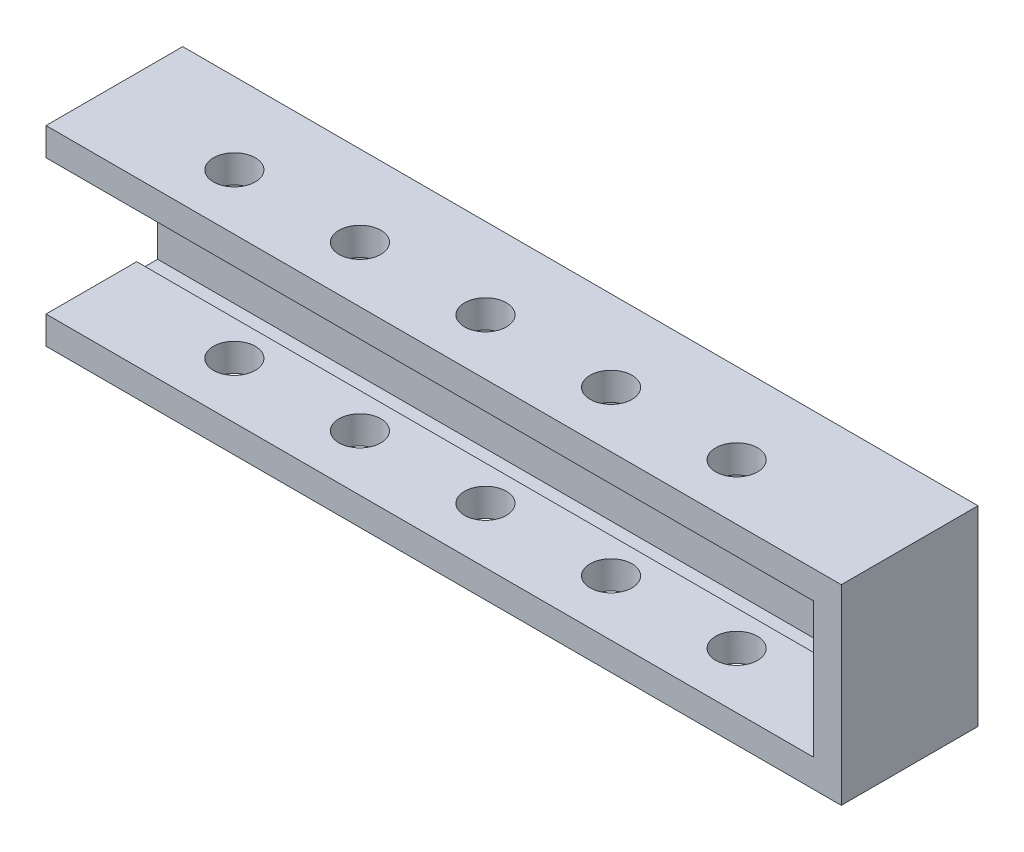
ISO-10303-21;
HEADER;
FILE_DESCRIPTION(('STEP AP214'),'2;1');
FILE_NAME('part.step','',(''),(''),'','','');
FILE_SCHEMA(('AUTOMOTIVE_DESIGN { 1 0 10303 214 1 1 1 1 }'));
ENDSEC;
DATA;
#1=APPLICATION_CONTEXT('core data for automotive mechanical design processes');
#2=APPLICATION_PROTOCOL_DEFINITION('international standard','automotive_design',2000,#1);
#3=PRODUCT_CONTEXT('',#1,'mechanical');
#4=PRODUCT('Part','Part','',(#3));
#5=PRODUCT_RELATED_PRODUCT_CATEGORY('part','',(#4));
#6=PRODUCT_DEFINITION_FORMATION('','',#4);
#7=PRODUCT_DEFINITION_CONTEXT('part definition',#1,'design');
#8=PRODUCT_DEFINITION('design','',#6,#7);
#9=PRODUCT_DEFINITION_SHAPE('','',#8);
#10=(LENGTH_UNIT() NAMED_UNIT(*) SI_UNIT(.MILLI.,.METRE.));
#11=(NAMED_UNIT(*) PLANE_ANGLE_UNIT() SI_UNIT($,.RADIAN.));
#12=(NAMED_UNIT(*) SI_UNIT($,.STERADIAN.) SOLID_ANGLE_UNIT());
#13=UNCERTAINTY_MEASURE_WITH_UNIT(LENGTH_MEASURE(1.E-05),#10,'distance_accuracy_value','');
#14=(GEOMETRIC_REPRESENTATION_CONTEXT(3) GLOBAL_UNCERTAINTY_ASSIGNED_CONTEXT((#13)) GLOBAL_UNIT_ASSIGNED_CONTEXT((#10,
#11,#12)) REPRESENTATION_CONTEXT('',''));
#15=CARTESIAN_POINT('',(0.,0.,0.));
#16=DIRECTION('',(0.,0.,1.));
#17=DIRECTION('',(1.,0.,0.));
#18=AXIS2_PLACEMENT_3D('',#15,#16,#17);
#19=CARTESIAN_POINT('',(0.,2.,1.8));
#20=DIRECTION('',(0.,-1.,0.));
#21=DIRECTION('',(0.,0.,-1.));
#22=AXIS2_PLACEMENT_3D('',#19,#20,#21);
#23=PLANE('',#22);
#24=CARTESIAN_POINT('',(9.5,2.,5.8));
#25=DIRECTION('',(0.,-1.,0.));
#26=DIRECTION('',(0.,0.,-1.));
#27=AXIS2_PLACEMENT_3D('',#24,#25,#26);
#28=CIRCLE('',#27,1.5);
#29=CARTESIAN_POINT('',(9.5,2.,4.3));
#30=VERTEX_POINT('',#29);
#31=EDGE_CURVE('E555',#30,#30,#28,.T.);
#32=ORIENTED_EDGE('',*,*,#31,.T.);
#33=EDGE_LOOP('',(#32));
#34=FACE_BOUND('',#33,.T.);
#35=CARTESIAN_POINT('',(18.5,2.,5.8));
#36=DIRECTION('',(0.,-1.,0.));
#37=DIRECTION('',(0.,0.,-1.));
#38=AXIS2_PLACEMENT_3D('',#35,#36,#37);
#39=CIRCLE('',#38,1.5);
#40=CARTESIAN_POINT('',(18.5,2.,4.3));
#41=VERTEX_POINT('',#40);
#42=EDGE_CURVE('E569',#41,#41,#39,.T.);
#43=ORIENTED_EDGE('',*,*,#42,.T.);
#44=EDGE_LOOP('',(#43));
#45=FACE_BOUND('',#44,.T.);
#46=CARTESIAN_POINT('',(27.5,2.,5.8));
#47=DIRECTION('',(0.,-1.,0.));
#48=DIRECTION('',(0.,0.,-1.));
#49=AXIS2_PLACEMENT_3D('',#46,#47,#48);
#50=CIRCLE('',#49,1.5);
#51=CARTESIAN_POINT('',(27.5,2.,4.3));
#52=VERTEX_POINT('',#51);
#53=EDGE_CURVE('E579',#52,#52,#50,.T.);
#54=ORIENTED_EDGE('',*,*,#53,.T.);
#55=EDGE_LOOP('',(#54));
#56=FACE_BOUND('',#55,.T.);
#57=CARTESIAN_POINT('',(36.5,2.,5.8));
#58=DIRECTION('',(0.,-1.,0.));
#59=DIRECTION('',(0.,0.,-1.));
#60=AXIS2_PLACEMENT_3D('',#57,#58,#59);
#61=CIRCLE('',#60,1.5);
#62=CARTESIAN_POINT('',(36.5,2.,4.3));
#63=VERTEX_POINT('',#62);
#64=EDGE_CURVE('E321',#63,#63,#61,.T.);
#65=ORIENTED_EDGE('',*,*,#64,.T.);
#66=EDGE_LOOP('',(#65));
#67=FACE_BOUND('',#66,.T.);
#68=CARTESIAN_POINT('',(45.5,2.,5.8));
#69=DIRECTION('',(0.,-1.,0.));
#70=DIRECTION('',(0.,0.,-1.));
#71=AXIS2_PLACEMENT_3D('',#68,#69,#70);
#72=CIRCLE('',#71,1.5);
#73=CARTESIAN_POINT('',(45.5,2.,4.3));
#74=VERTEX_POINT('',#73);
#75=EDGE_CURVE('E163',#74,#74,#72,.T.);
#76=ORIENTED_EDGE('',*,*,#75,.T.);
#77=EDGE_LOOP('',(#76));
#78=FACE_BOUND('',#77,.T.);
#79=DIRECTION('',(0.,0.,-1.));
#80=VECTOR('',#79,1.);
#81=CARTESIAN_POINT('',(54.9720870218535,2.,3.3));
#82=LINE('',#81,#80);
#83=CARTESIAN_POINT('',(54.9720870218535,2.,3.3));
#84=VERTEX_POINT('',#83);
#85=CARTESIAN_POINT('',(54.9720870218535,2.,1.8));
#86=VERTEX_POINT('',#85);
#87=EDGE_CURVE('E50',#84,#86,#82,.T.);
#88=ORIENTED_EDGE('',*,*,#87,.F.);
#89=DIRECTION('',(-1.,0.,0.));
#90=VECTOR('',#89,1.);
#91=CARTESIAN_POINT('',(0.,2.,3.3));
#92=LINE('',#91,#90);
#93=CARTESIAN_POINT('',(0.,2.,3.3));
#94=VERTEX_POINT('',#93);
#95=EDGE_CURVE('E167',#84,#94,#92,.T.);
#96=ORIENTED_EDGE('',*,*,#95,.T.);
#97=DIRECTION('',(0.,0.,1.));
#98=VECTOR('',#97,1.);
#99=CARTESIAN_POINT('',(0.,2.,1.8));
#100=LINE('',#99,#98);
#101=CARTESIAN_POINT('',(0.,2.,9.8));
#102=VERTEX_POINT('',#101);
#103=EDGE_CURVE('E58',#94,#102,#100,.T.);
#104=ORIENTED_EDGE('',*,*,#103,.T.);
#105=DIRECTION('',(1.,0.,0.));
#106=VECTOR('',#105,1.);
#107=CARTESIAN_POINT('',(0.,2.,9.8));
#108=LINE('',#107,#106);
#109=CARTESIAN_POINT('',(55.,2.,9.8));
#110=VERTEX_POINT('',#109);
#111=EDGE_CURVE('E195',#102,#110,#108,.T.);
#112=ORIENTED_EDGE('',*,*,#111,.T.);
#113=DIRECTION('',(0.,0.,1.));
#114=VECTOR('',#113,1.);
#115=CARTESIAN_POINT('',(55.,2.,1.8));
#116=LINE('',#115,#114);
#117=CARTESIAN_POINT('',(55.,2.,1.8));
#118=VERTEX_POINT('',#117);
#119=EDGE_CURVE('E218',#118,#110,#116,.T.);
#120=ORIENTED_EDGE('',*,*,#119,.F.);
#121=DIRECTION('',(1.,0.,0.));
#122=VECTOR('',#121,1.);
#123=CARTESIAN_POINT('',(0.,2.,1.8));
#124=LINE('',#123,#122);
#125=EDGE_CURVE('E198',#86,#118,#124,.T.);
#126=ORIENTED_EDGE('',*,*,#125,.F.);
#127=EDGE_LOOP('',(#88,#96,#104,#112,#120,#126));
#128=FACE_BOUND('',#127,.T.);
#129=ADVANCED_FACE('F35',(#34,#45,#56,#67,#78,#128),#23,.F.);
#130=CARTESIAN_POINT('',(0.,0.,9.8));
#131=DIRECTION('',(1.,0.,0.));
#132=DIRECTION('',(0.,0.,-1.));
#133=AXIS2_PLACEMENT_3D('',#130,#131,#132);
#134=PLANE('',#133);
#135=ORIENTED_EDGE('',*,*,#103,.F.);
#136=DIRECTION('',(0.,-1.,0.));
#137=VECTOR('',#136,1.);
#138=CARTESIAN_POINT('',(0.,2.,3.3));
#139=LINE('',#138,#137);
#140=CARTESIAN_POINT('',(0.,1.4,3.3));
#141=VERTEX_POINT('',#140);
#142=EDGE_CURVE('E143',#94,#141,#139,.T.);
#143=ORIENTED_EDGE('',*,*,#142,.T.);
#144=DIRECTION('',(0.,0.,-1.));
#145=VECTOR('',#144,1.);
#146=CARTESIAN_POINT('',(0.,1.4,3.3));
#147=LINE('',#146,#145);
#148=CARTESIAN_POINT('',(0.,1.4,1.8));
#149=VERTEX_POINT('',#148);
#150=EDGE_CURVE('E151',#141,#149,#147,.T.);
#151=ORIENTED_EDGE('',*,*,#150,.T.);
#152=DIRECTION('',(0.,-1.,0.));
#153=VECTOR('',#152,1.);
#154=CARTESIAN_POINT('',(0.,11.7,1.8));
#155=LINE('',#154,#153);
#156=CARTESIAN_POINT('',(0.,12.3,1.8));
#157=VERTEX_POINT('',#156);
#158=EDGE_CURVE('E196',#157,#149,#155,.T.);
#159=ORIENTED_EDGE('',*,*,#158,.F.);
#160=DIRECTION('',(0.,0.,-1.));
#161=VECTOR('',#160,1.);
#162=CARTESIAN_POINT('',(0.,12.3,3.3));
#163=LINE('',#162,#161);
#164=CARTESIAN_POINT('',(0.,12.3,3.3));
#165=VERTEX_POINT('',#164);
#166=EDGE_CURVE('E183',#165,#157,#163,.T.);
#167=ORIENTED_EDGE('',*,*,#166,.F.);
#168=DIRECTION('',(0.,-1.,0.));
#169=VECTOR('',#168,1.);
#170=CARTESIAN_POINT('',(0.,11.7,3.3));
#171=LINE('',#170,#169);
#172=CARTESIAN_POINT('',(0.,11.7,3.3));
#173=VERTEX_POINT('',#172);
#174=EDGE_CURVE('E172',#165,#173,#171,.T.);
#175=ORIENTED_EDGE('',*,*,#174,.T.);
#176=DIRECTION('',(0.,0.,1.));
#177=VECTOR('',#176,1.);
#178=CARTESIAN_POINT('',(0.,11.7,1.8));
#179=LINE('',#178,#177);
#180=CARTESIAN_POINT('',(0.,11.7,9.8));
#181=VERTEX_POINT('',#180);
#182=EDGE_CURVE('E213',#173,#181,#179,.T.);
#183=ORIENTED_EDGE('',*,*,#182,.T.);
#184=DIRECTION('',(0.,-1.,0.));
#185=VECTOR('',#184,1.);
#186=CARTESIAN_POINT('',(0.,0.,9.8));
#187=LINE('',#186,#185);
#188=CARTESIAN_POINT('',(0.,13.7,9.8));
#189=VERTEX_POINT('',#188);
#190=EDGE_CURVE('E221',#189,#181,#187,.T.);
#191=ORIENTED_EDGE('',*,*,#190,.F.);
#192=DIRECTION('',(0.,0.,-1.));
#193=VECTOR('',#192,1.);
#194=CARTESIAN_POINT('',(0.,13.7,9.8));
#195=LINE('',#194,#193);
#196=CARTESIAN_POINT('',(0.,13.7,0.));
#197=VERTEX_POINT('',#196);
#198=EDGE_CURVE('E231',#189,#197,#195,.T.);
#199=ORIENTED_EDGE('',*,*,#198,.T.);
#200=DIRECTION('',(0.,-1.,0.));
#201=VECTOR('',#200,1.);
#202=CARTESIAN_POINT('',(0.,0.,0.));
#203=LINE('',#202,#201);
#204=CARTESIAN_POINT('',(0.,0.,0.));
#205=VERTEX_POINT('',#204);
#206=EDGE_CURVE('E215',#197,#205,#203,.T.);
#207=ORIENTED_EDGE('',*,*,#206,.T.);
#208=DIRECTION('',(0.,0.,-1.));
#209=VECTOR('',#208,1.);
#210=CARTESIAN_POINT('',(0.,0.,9.8));
#211=LINE('',#210,#209);
#212=CARTESIAN_POINT('',(0.,0.,9.8));
#213=VERTEX_POINT('',#212);
#214=EDGE_CURVE('E11',#213,#205,#211,.T.);
#215=ORIENTED_EDGE('',*,*,#214,.F.);
#216=EDGE_CURVE('E225',#102,#213,#187,.T.);
#217=ORIENTED_EDGE('',*,*,#216,.F.);
#218=EDGE_LOOP('',(#135,#143,#151,#159,#167,#175,#183,#191,#199,#207,#215,#217));
#219=FACE_BOUND('',#218,.T.);
#220=ADVANCED_FACE('F37',(#219),#134,.F.);
#221=CARTESIAN_POINT('',(0.,11.7,1.8));
#222=DIRECTION('',(0.,1.,0.));
#223=DIRECTION('',(0.,0.,1.));
#224=AXIS2_PLACEMENT_3D('',#221,#222,#223);
#225=PLANE('',#224);
#226=CARTESIAN_POINT('',(9.5,11.7,5.8));
#227=DIRECTION('',(0.,1.,0.));
#228=DIRECTION('',(0.,0.,1.));
#229=AXIS2_PLACEMENT_3D('',#226,#227,#228);
#230=CIRCLE('',#229,1.5);
#231=CARTESIAN_POINT('',(9.5,11.7,7.3));
#232=VERTEX_POINT('',#231);
#233=EDGE_CURVE('E556',#232,#232,#230,.T.);
#234=ORIENTED_EDGE('',*,*,#233,.T.);
#235=EDGE_LOOP('',(#234));
#236=FACE_BOUND('',#235,.T.);
#237=CARTESIAN_POINT('',(18.5,11.7,5.8));
#238=DIRECTION('',(0.,1.,0.));
#239=DIRECTION('',(0.,0.,1.));
#240=AXIS2_PLACEMENT_3D('',#237,#238,#239);
#241=CIRCLE('',#240,1.5);
#242=CARTESIAN_POINT('',(18.5,11.7,7.3));
#243=VERTEX_POINT('',#242);
#244=EDGE_CURVE('E566',#243,#243,#241,.T.);
#245=ORIENTED_EDGE('',*,*,#244,.T.);
#246=EDGE_LOOP('',(#245));
#247=FACE_BOUND('',#246,.T.);
#248=CARTESIAN_POINT('',(27.5,11.7,5.8));
#249=DIRECTION('',(0.,1.,0.));
#250=DIRECTION('',(0.,0.,1.));
#251=AXIS2_PLACEMENT_3D('',#248,#249,#250);
#252=CIRCLE('',#251,1.5);
#253=CARTESIAN_POINT('',(27.5,11.7,7.3));
#254=VERTEX_POINT('',#253);
#255=EDGE_CURVE('E576',#254,#254,#252,.T.);
#256=ORIENTED_EDGE('',*,*,#255,.T.);
#257=EDGE_LOOP('',(#256));
#258=FACE_BOUND('',#257,.T.);
#259=CARTESIAN_POINT('',(36.5,11.7,5.8));
#260=DIRECTION('',(0.,1.,0.));
#261=DIRECTION('',(0.,0.,1.));
#262=AXIS2_PLACEMENT_3D('',#259,#260,#261);
#263=CIRCLE('',#262,1.5);
#264=CARTESIAN_POINT('',(36.5,11.7,7.30000000000001));
#265=VERTEX_POINT('',#264);
#266=EDGE_CURVE('E327',#265,#265,#263,.T.);
#267=ORIENTED_EDGE('',*,*,#266,.T.);
#268=EDGE_LOOP('',(#267));
#269=FACE_BOUND('',#268,.T.);
#270=CARTESIAN_POINT('',(45.5,11.7,5.8));
#271=DIRECTION('',(0.,1.,0.));
#272=DIRECTION('',(0.,0.,1.));
#273=AXIS2_PLACEMENT_3D('',#270,#271,#272);
#274=CIRCLE('',#273,1.5);
#275=CARTESIAN_POINT('',(45.5,11.7,7.30000000000001));
#276=VERTEX_POINT('',#275);
#277=EDGE_CURVE('E324',#276,#276,#274,.T.);
#278=ORIENTED_EDGE('',*,*,#277,.T.);
#279=EDGE_LOOP('',(#278));
#280=FACE_BOUND('',#279,.T.);
#281=DIRECTION('',(0.,0.,-1.));
#282=VECTOR('',#281,1.);
#283=CARTESIAN_POINT('',(54.9720870218535,11.7,3.3));
#284=LINE('',#283,#282);
#285=CARTESIAN_POINT('',(54.9720870218535,11.7,3.3));
#286=VERTEX_POINT('',#285);
#287=CARTESIAN_POINT('',(54.9720870218535,11.7,1.8));
#288=VERTEX_POINT('',#287);
#289=EDGE_CURVE('E192',#286,#288,#284,.T.);
#290=ORIENTED_EDGE('',*,*,#289,.T.);
#291=DIRECTION('',(-1.,0.,0.));
#292=VECTOR('',#291,1.);
#293=CARTESIAN_POINT('',(0.,11.7,1.8));
#294=LINE('',#293,#292);
#295=CARTESIAN_POINT('',(55.,11.7,1.8));
#296=VERTEX_POINT('',#295);
#297=EDGE_CURVE('E204',#296,#288,#294,.T.);
#298=ORIENTED_EDGE('',*,*,#297,.F.);
#299=DIRECTION('',(0.,0.,1.));
#300=VECTOR('',#299,1.);
#301=CARTESIAN_POINT('',(55.,11.7,1.8));
#302=LINE('',#301,#300);
#303=CARTESIAN_POINT('',(55.,11.7,9.8));
#304=VERTEX_POINT('',#303);
#305=EDGE_CURVE('E216',#296,#304,#302,.T.);
#306=ORIENTED_EDGE('',*,*,#305,.T.);
#307=DIRECTION('',(-1.,0.,0.));
#308=VECTOR('',#307,1.);
#309=CARTESIAN_POINT('',(0.,11.7,9.8));
#310=LINE('',#309,#308);
#311=EDGE_CURVE('E199',#304,#181,#310,.T.);
#312=ORIENTED_EDGE('',*,*,#311,.T.);
#313=ORIENTED_EDGE('',*,*,#182,.F.);
#314=DIRECTION('',(1.,0.,0.));
#315=VECTOR('',#314,1.);
#316=CARTESIAN_POINT('',(0.,11.7,3.3));
#317=LINE('',#316,#315);
#318=EDGE_CURVE('E175',#173,#286,#317,.T.);
#319=ORIENTED_EDGE('',*,*,#318,.T.);
#320=EDGE_LOOP('',(#290,#298,#306,#312,#313,#319));
#321=FACE_BOUND('',#320,.T.);
#322=ADVANCED_FACE('F270',(#236,#247,#258,#269,#280,#321),#225,.F.);
#323=CARTESIAN_POINT('',(0.,0.,9.8));
#324=DIRECTION('',(0.,1.,0.));
#325=DIRECTION('',(0.,0.,1.));
#326=AXIS2_PLACEMENT_3D('',#323,#324,#325);
#327=PLANE('',#326);
#328=CARTESIAN_POINT('',(9.5,0.,5.8));
#329=DIRECTION('',(0.,1.,0.));
#330=DIRECTION('',(0.,0.,1.));
#331=AXIS2_PLACEMENT_3D('',#328,#329,#330);
#332=CIRCLE('',#331,1.5);
#333=CARTESIAN_POINT('',(9.5,0.,7.3));
#334=VERTEX_POINT('',#333);
#335=EDGE_CURVE('E553',#334,#334,#332,.T.);
#336=ORIENTED_EDGE('',*,*,#335,.T.);
#337=EDGE_LOOP('',(#336));
#338=FACE_BOUND('',#337,.T.);
#339=CARTESIAN_POINT('',(18.5,0.,5.8));
#340=DIRECTION('',(0.,1.,0.));
#341=DIRECTION('',(0.,0.,1.));
#342=AXIS2_PLACEMENT_3D('',#339,#340,#341);
#343=CIRCLE('',#342,1.5);
#344=CARTESIAN_POINT('',(18.5,0.,7.3));
#345=VERTEX_POINT('',#344);
#346=EDGE_CURVE('E558',#345,#345,#343,.T.);
#347=ORIENTED_EDGE('',*,*,#346,.T.);
#348=EDGE_LOOP('',(#347));
#349=FACE_BOUND('',#348,.T.);
#350=CARTESIAN_POINT('',(27.5,0.,5.8));
#351=DIRECTION('',(0.,1.,0.));
#352=DIRECTION('',(0.,0.,1.));
#353=AXIS2_PLACEMENT_3D('',#350,#351,#352);
#354=CIRCLE('',#353,1.5);
#355=CARTESIAN_POINT('',(27.5,0.,7.3));
#356=VERTEX_POINT('',#355);
#357=EDGE_CURVE('E573',#356,#356,#354,.T.);
#358=ORIENTED_EDGE('',*,*,#357,.T.);
#359=EDGE_LOOP('',(#358));
#360=FACE_BOUND('',#359,.T.);
#361=CARTESIAN_POINT('',(36.5,0.,5.8));
#362=DIRECTION('',(0.,1.,0.));
#363=DIRECTION('',(0.,0.,1.));
#364=AXIS2_PLACEMENT_3D('',#361,#362,#363);
#365=CIRCLE('',#364,1.5);
#366=CARTESIAN_POINT('',(36.5,0.,7.30000000000001));
#367=VERTEX_POINT('',#366);
#368=EDGE_CURVE('E583',#367,#367,#365,.T.);
#369=ORIENTED_EDGE('',*,*,#368,.T.);
#370=EDGE_LOOP('',(#369));
#371=FACE_BOUND('',#370,.T.);
#372=CARTESIAN_POINT('',(45.5,0.,5.8));
#373=DIRECTION('',(0.,1.,0.));
#374=DIRECTION('',(0.,0.,1.));
#375=AXIS2_PLACEMENT_3D('',#372,#373,#374);
#376=CIRCLE('',#375,1.5);
#377=CARTESIAN_POINT('',(45.5,0.,7.30000000000001));
#378=VERTEX_POINT('',#377);
#379=EDGE_CURVE('E320',#378,#378,#376,.T.);
#380=ORIENTED_EDGE('',*,*,#379,.T.);
#381=EDGE_LOOP('',(#380));
#382=FACE_BOUND('',#381,.T.);
#383=DIRECTION('',(1.,0.,0.));
#384=VECTOR('',#383,1.);
#385=CARTESIAN_POINT('',(0.,0.,0.));
#386=LINE('',#385,#384);
#387=CARTESIAN_POINT('',(57.,0.,0.));
#388=VERTEX_POINT('',#387);
#389=EDGE_CURVE('E234',#205,#388,#386,.T.);
#390=ORIENTED_EDGE('',*,*,#389,.T.);
#391=DIRECTION('',(0.,0.,-1.));
#392=VECTOR('',#391,1.);
#393=CARTESIAN_POINT('',(57.,0.,9.8));
#394=LINE('',#393,#392);
#395=CARTESIAN_POINT('',(57.,0.,9.8));
#396=VERTEX_POINT('',#395);
#397=EDGE_CURVE('E43',#396,#388,#394,.T.);
#398=ORIENTED_EDGE('',*,*,#397,.F.);
#399=DIRECTION('',(1.,0.,0.));
#400=VECTOR('',#399,1.);
#401=CARTESIAN_POINT('',(0.,0.,9.8));
#402=LINE('',#401,#400);
#403=EDGE_CURVE('E224',#213,#396,#402,.T.);
#404=ORIENTED_EDGE('',*,*,#403,.F.);
#405=ORIENTED_EDGE('',*,*,#214,.T.);
#406=EDGE_LOOP('',(#390,#398,#404,#405));
#407=FACE_BOUND('',#406,.T.);
#408=ADVANCED_FACE('F268',(#338,#349,#360,#371,#382,#407),#327,.F.);
#409=CARTESIAN_POINT('',(57.,0.,9.8));
#410=DIRECTION('',(-1.,0.,0.));
#411=DIRECTION('',(0.,0.,1.));
#412=AXIS2_PLACEMENT_3D('',#409,#410,#411);
#413=PLANE('',#412);
#414=DIRECTION('',(0.,1.,0.));
#415=VECTOR('',#414,1.);
#416=CARTESIAN_POINT('',(57.,0.,0.));
#417=LINE('',#416,#415);
#418=CARTESIAN_POINT('',(57.,13.7,0.));
#419=VERTEX_POINT('',#418);
#420=EDGE_CURVE('E236',#388,#419,#417,.T.);
#421=ORIENTED_EDGE('',*,*,#420,.T.);
#422=DIRECTION('',(0.,0.,-1.));
#423=VECTOR('',#422,1.);
#424=CARTESIAN_POINT('',(57.,13.7,9.8));
#425=LINE('',#424,#423);
#426=CARTESIAN_POINT('',(57.,13.7,9.8));
#427=VERTEX_POINT('',#426);
#428=EDGE_CURVE('E242',#427,#419,#425,.T.);
#429=ORIENTED_EDGE('',*,*,#428,.F.);
#430=DIRECTION('',(0.,1.,0.));
#431=VECTOR('',#430,1.);
#432=CARTESIAN_POINT('',(57.,0.,9.8));
#433=LINE('',#432,#431);
#434=EDGE_CURVE('E227',#396,#427,#433,.T.);
#435=ORIENTED_EDGE('',*,*,#434,.F.);
#436=ORIENTED_EDGE('',*,*,#397,.T.);
#437=EDGE_LOOP('',(#421,#429,#435,#436));
#438=FACE_BOUND('',#437,.T.);
#439=ADVANCED_FACE('F249',(#438),#413,.F.);
#440=CARTESIAN_POINT('',(0.,13.7,9.8));
#441=DIRECTION('',(0.,-1.,0.));
#442=DIRECTION('',(0.,0.,-1.));
#443=AXIS2_PLACEMENT_3D('',#440,#441,#442);
#444=PLANE('',#443);
#445=CARTESIAN_POINT('',(9.5,13.7,5.8));
#446=DIRECTION('',(0.,1.,0.));
#447=DIRECTION('',(0.,0.,1.));
#448=AXIS2_PLACEMENT_3D('',#445,#446,#447);
#449=CIRCLE('',#448,1.5);
#450=CARTESIAN_POINT('',(9.5,13.7,7.3));
#451=VERTEX_POINT('',#450);
#452=EDGE_CURVE('E303',#451,#451,#449,.T.);
#453=ORIENTED_EDGE('',*,*,#452,.F.);
#454=EDGE_LOOP('',(#453));
#455=FACE_BOUND('',#454,.T.);
#456=CARTESIAN_POINT('',(18.5,13.7,5.8));
#457=DIRECTION('',(0.,1.,0.));
#458=DIRECTION('',(0.,0.,1.));
#459=AXIS2_PLACEMENT_3D('',#456,#457,#458);
#460=CIRCLE('',#459,1.5);
#461=CARTESIAN_POINT('',(18.5,13.7,7.3));
#462=VERTEX_POINT('',#461);
#463=EDGE_CURVE('E307',#462,#462,#460,.T.);
#464=ORIENTED_EDGE('',*,*,#463,.F.);
#465=EDGE_LOOP('',(#464));
#466=FACE_BOUND('',#465,.T.);
#467=CARTESIAN_POINT('',(27.5,13.7,5.8));
#468=DIRECTION('',(0.,1.,0.));
#469=DIRECTION('',(0.,0.,1.));
#470=AXIS2_PLACEMENT_3D('',#467,#468,#469);
#471=CIRCLE('',#470,1.5);
#472=CARTESIAN_POINT('',(27.5,13.7,7.3));
#473=VERTEX_POINT('',#472);
#474=EDGE_CURVE('E311',#473,#473,#471,.T.);
#475=ORIENTED_EDGE('',*,*,#474,.F.);
#476=EDGE_LOOP('',(#475));
#477=FACE_BOUND('',#476,.T.);
#478=CARTESIAN_POINT('',(36.5,13.7,5.8));
#479=DIRECTION('',(0.,1.,0.));
#480=DIRECTION('',(0.,0.,1.));
#481=AXIS2_PLACEMENT_3D('',#478,#479,#480);
#482=CIRCLE('',#481,1.5);
#483=CARTESIAN_POINT('',(36.5,13.7,7.30000000000001));
#484=VERTEX_POINT('',#483);
#485=EDGE_CURVE('E315',#484,#484,#482,.T.);
#486=ORIENTED_EDGE('',*,*,#485,.F.);
#487=EDGE_LOOP('',(#486));
#488=FACE_BOUND('',#487,.T.);
#489=CARTESIAN_POINT('',(45.5,13.7,5.8));
#490=DIRECTION('',(0.,1.,0.));
#491=DIRECTION('',(0.,0.,1.));
#492=AXIS2_PLACEMENT_3D('',#489,#490,#491);
#493=CIRCLE('',#492,1.5);
#494=CARTESIAN_POINT('',(45.5,13.7,7.30000000000001));
#495=VERTEX_POINT('',#494);
#496=EDGE_CURVE('E318',#495,#495,#493,.T.);
#497=ORIENTED_EDGE('',*,*,#496,.F.);
#498=EDGE_LOOP('',(#497));
#499=FACE_BOUND('',#498,.T.);
#500=DIRECTION('',(-1.,0.,0.));
#501=VECTOR('',#500,1.);
#502=CARTESIAN_POINT('',(0.,13.7,0.));
#503=LINE('',#502,#501);
#504=EDGE_CURVE('E238',#419,#197,#503,.T.);
#505=ORIENTED_EDGE('',*,*,#504,.T.);
#506=ORIENTED_EDGE('',*,*,#198,.F.);
#507=DIRECTION('',(-1.,0.,0.));
#508=VECTOR('',#507,1.);
#509=CARTESIAN_POINT('',(0.,13.7,9.8));
#510=LINE('',#509,#508);
#511=EDGE_CURVE('E229',#427,#189,#510,.T.);
#512=ORIENTED_EDGE('',*,*,#511,.F.);
#513=ORIENTED_EDGE('',*,*,#428,.T.);
#514=EDGE_LOOP('',(#505,#506,#512,#513));
#515=FACE_BOUND('',#514,.T.);
#516=ADVANCED_FACE('F259',(#455,#466,#477,#488,#499,#515),#444,.F.);
#517=CARTESIAN_POINT('',(0.,0.,9.8));
#518=DIRECTION('',(0.,0.,-1.));
#519=DIRECTION('',(-1.,0.,0.));
#520=AXIS2_PLACEMENT_3D('',#517,#518,#519);
#521=PLANE('',#520);
#522=ORIENTED_EDGE('',*,*,#190,.T.);
#523=ORIENTED_EDGE('',*,*,#311,.F.);
#524=DIRECTION('',(0.,1.,0.));
#525=VECTOR('',#524,1.);
#526=CARTESIAN_POINT('',(55.,11.7,9.8));
#527=LINE('',#526,#525);
#528=EDGE_CURVE('E208',#110,#304,#527,.T.);
#529=ORIENTED_EDGE('',*,*,#528,.F.);
#530=ORIENTED_EDGE('',*,*,#111,.F.);
#531=ORIENTED_EDGE('',*,*,#216,.T.);
#532=ORIENTED_EDGE('',*,*,#403,.T.);
#533=ORIENTED_EDGE('',*,*,#434,.T.);
#534=ORIENTED_EDGE('',*,*,#511,.T.);
#535=EDGE_LOOP('',(#522,#523,#529,#530,#531,#532,#533,#534));
#536=FACE_BOUND('',#535,.T.);
#537=ADVANCED_FACE('F266',(#536),#521,.F.);
#538=CARTESIAN_POINT('',(0.,0.,0.));
#539=DIRECTION('',(0.,0.,-1.));
#540=DIRECTION('',(-1.,0.,0.));
#541=AXIS2_PLACEMENT_3D('',#538,#539,#540);
#542=PLANE('',#541);
#543=ORIENTED_EDGE('',*,*,#206,.F.);
#544=ORIENTED_EDGE('',*,*,#504,.F.);
#545=ORIENTED_EDGE('',*,*,#420,.F.);
#546=ORIENTED_EDGE('',*,*,#389,.F.);
#547=EDGE_LOOP('',(#543,#544,#545,#546));
#548=FACE_BOUND('',#547,.T.);
#549=ADVANCED_FACE('F256',(#548),#542,.T.);
#550=CARTESIAN_POINT('',(55.,11.7,1.8));
#551=DIRECTION('',(1.,0.,0.));
#552=DIRECTION('',(0.,0.,-1.));
#553=AXIS2_PLACEMENT_3D('',#550,#551,#552);
#554=PLANE('',#553);
#555=ORIENTED_EDGE('',*,*,#528,.T.);
#556=ORIENTED_EDGE('',*,*,#305,.F.);
#557=DIRECTION('',(0.,1.,0.));
#558=VECTOR('',#557,1.);
#559=CARTESIAN_POINT('',(55.,11.7,1.8));
#560=LINE('',#559,#558);
#561=EDGE_CURVE('E201',#118,#296,#560,.T.);
#562=ORIENTED_EDGE('',*,*,#561,.F.);
#563=ORIENTED_EDGE('',*,*,#119,.T.);
#564=EDGE_LOOP('',(#555,#556,#562,#563));
#565=FACE_BOUND('',#564,.T.);
#566=ADVANCED_FACE('F291',(#565),#554,.F.);
#567=CARTESIAN_POINT('',(0.,0.,1.8));
#568=DIRECTION('',(0.,0.,1.));
#569=DIRECTION('',(1.,0.,0.));
#570=AXIS2_PLACEMENT_3D('',#567,#568,#569);
#571=PLANE('',#570);
#572=ORIENTED_EDGE('',*,*,#158,.T.);
#573=DIRECTION('',(1.,0.,0.));
#574=VECTOR('',#573,1.);
#575=CARTESIAN_POINT('',(0.,1.4,1.8));
#576=LINE('',#575,#574);
#577=CARTESIAN_POINT('',(54.9720870218535,1.4,1.8));
#578=VERTEX_POINT('',#577);
#579=EDGE_CURVE('E153',#149,#578,#576,.T.);
#580=ORIENTED_EDGE('',*,*,#579,.T.);
#581=DIRECTION('',(0.,1.,0.));
#582=VECTOR('',#581,1.);
#583=CARTESIAN_POINT('',(54.9720870218535,2.,1.8));
#584=LINE('',#583,#582);
#585=EDGE_CURVE('E159',#578,#86,#584,.T.);
#586=ORIENTED_EDGE('',*,*,#585,.T.);
#587=ORIENTED_EDGE('',*,*,#125,.T.);
#588=ORIENTED_EDGE('',*,*,#561,.T.);
#589=ORIENTED_EDGE('',*,*,#297,.T.);
#590=DIRECTION('',(0.,1.,0.));
#591=VECTOR('',#590,1.);
#592=CARTESIAN_POINT('',(54.9720870218535,11.7,1.8));
#593=LINE('',#592,#591);
#594=CARTESIAN_POINT('',(54.9720870218535,12.3,1.8));
#595=VERTEX_POINT('',#594);
#596=EDGE_CURVE('E155',#288,#595,#593,.T.);
#597=ORIENTED_EDGE('',*,*,#596,.T.);
#598=DIRECTION('',(-1.,0.,0.));
#599=VECTOR('',#598,1.);
#600=CARTESIAN_POINT('',(0.,12.3,1.8));
#601=LINE('',#600,#599);
#602=EDGE_CURVE('E176',#595,#157,#601,.T.);
#603=ORIENTED_EDGE('',*,*,#602,.T.);
#604=EDGE_LOOP('',(#572,#580,#586,#587,#588,#589,#597,#603));
#605=FACE_BOUND('',#604,.T.);
#606=ADVANCED_FACE('F371',(#605),#571,.T.);
#607=CARTESIAN_POINT('',(54.9720870218535,11.7,3.3));
#608=DIRECTION('',(-1.,0.,0.));
#609=DIRECTION('',(0.,0.,1.));
#610=AXIS2_PLACEMENT_3D('',#607,#608,#609);
#611=PLANE('',#610);
#612=ORIENTED_EDGE('',*,*,#596,.F.);
#613=ORIENTED_EDGE('',*,*,#289,.F.);
#614=DIRECTION('',(0.,1.,0.));
#615=VECTOR('',#614,1.);
#616=CARTESIAN_POINT('',(54.9720870218535,11.7,3.3));
#617=LINE('',#616,#615);
#618=CARTESIAN_POINT('',(54.9720870218535,12.3,3.3));
#619=VERTEX_POINT('',#618);
#620=EDGE_CURVE('E179',#286,#619,#617,.T.);
#621=ORIENTED_EDGE('',*,*,#620,.T.);
#622=DIRECTION('',(0.,0.,-1.));
#623=VECTOR('',#622,1.);
#624=CARTESIAN_POINT('',(54.9720870218535,12.3,3.3));
#625=LINE('',#624,#623);
#626=EDGE_CURVE('E189',#619,#595,#625,.T.);
#627=ORIENTED_EDGE('',*,*,#626,.T.);
#628=EDGE_LOOP('',(#612,#613,#621,#627));
#629=FACE_BOUND('',#628,.T.);
#630=ADVANCED_FACE('F367',(#629),#611,.T.);
#631=CARTESIAN_POINT('',(0.,12.3,3.3));
#632=DIRECTION('',(0.,-1.,0.));
#633=DIRECTION('',(0.,0.,-1.));
#634=AXIS2_PLACEMENT_3D('',#631,#632,#633);
#635=PLANE('',#634);
#636=ORIENTED_EDGE('',*,*,#602,.F.);
#637=ORIENTED_EDGE('',*,*,#626,.F.);
#638=DIRECTION('',(-1.,0.,0.));
#639=VECTOR('',#638,1.);
#640=CARTESIAN_POINT('',(0.,12.3,3.3));
#641=LINE('',#640,#639);
#642=EDGE_CURVE('E181',#619,#165,#641,.T.);
#643=ORIENTED_EDGE('',*,*,#642,.T.);
#644=ORIENTED_EDGE('',*,*,#166,.T.);
#645=EDGE_LOOP('',(#636,#637,#643,#644));
#646=FACE_BOUND('',#645,.T.);
#647=ADVANCED_FACE('F363',(#646),#635,.T.);
#648=CARTESIAN_POINT('',(0.,0.,3.3));
#649=DIRECTION('',(0.,0.,-1.));
#650=DIRECTION('',(-1.,0.,0.));
#651=AXIS2_PLACEMENT_3D('',#648,#649,#650);
#652=PLANE('',#651);
#653=ORIENTED_EDGE('',*,*,#174,.F.);
#654=ORIENTED_EDGE('',*,*,#642,.F.);
#655=ORIENTED_EDGE('',*,*,#620,.F.);
#656=ORIENTED_EDGE('',*,*,#318,.F.);
#657=EDGE_LOOP('',(#653,#654,#655,#656));
#658=FACE_BOUND('',#657,.T.);
#659=ADVANCED_FACE('F360',(#658),#652,.T.);
#660=CARTESIAN_POINT('',(0.,1.4,3.3));
#661=DIRECTION('',(0.,1.,0.));
#662=DIRECTION('',(0.,0.,1.));
#663=AXIS2_PLACEMENT_3D('',#660,#661,#662);
#664=PLANE('',#663);
#665=ORIENTED_EDGE('',*,*,#579,.F.);
#666=ORIENTED_EDGE('',*,*,#150,.F.);
#667=DIRECTION('',(1.,0.,0.));
#668=VECTOR('',#667,1.);
#669=CARTESIAN_POINT('',(0.,1.4,3.3));
#670=LINE('',#669,#668);
#671=CARTESIAN_POINT('',(54.9720870218535,1.4,3.3));
#672=VERTEX_POINT('',#671);
#673=EDGE_CURVE('E138',#141,#672,#670,.T.);
#674=ORIENTED_EDGE('',*,*,#673,.T.);
#675=DIRECTION('',(0.,0.,-1.));
#676=VECTOR('',#675,1.);
#677=CARTESIAN_POINT('',(54.9720870218535,1.4,3.3));
#678=LINE('',#677,#676);
#679=EDGE_CURVE('E156',#672,#578,#678,.T.);
#680=ORIENTED_EDGE('',*,*,#679,.T.);
#681=EDGE_LOOP('',(#665,#666,#674,#680));
#682=FACE_BOUND('',#681,.T.);
#683=ADVANCED_FACE('F152',(#682),#664,.T.);
#684=CARTESIAN_POINT('',(54.9720870218535,2.,3.3));
#685=DIRECTION('',(-1.,0.,0.));
#686=DIRECTION('',(0.,0.,1.));
#687=AXIS2_PLACEMENT_3D('',#684,#685,#686);
#688=PLANE('',#687);
#689=ORIENTED_EDGE('',*,*,#585,.F.);
#690=ORIENTED_EDGE('',*,*,#679,.F.);
#691=DIRECTION('',(0.,1.,0.));
#692=VECTOR('',#691,1.);
#693=CARTESIAN_POINT('',(54.9720870218535,2.,3.3));
#694=LINE('',#693,#692);
#695=EDGE_CURVE('E144',#672,#84,#694,.T.);
#696=ORIENTED_EDGE('',*,*,#695,.T.);
#697=ORIENTED_EDGE('',*,*,#87,.T.);
#698=EDGE_LOOP('',(#689,#690,#696,#697));
#699=FACE_BOUND('',#698,.T.);
#700=ADVANCED_FACE('F355',(#699),#688,.T.);
#701=CARTESIAN_POINT('',(0.,0.,3.3));
#702=DIRECTION('',(0.,0.,1.));
#703=DIRECTION('',(1.,0.,0.));
#704=AXIS2_PLACEMENT_3D('',#701,#702,#703);
#705=PLANE('',#704);
#706=ORIENTED_EDGE('',*,*,#142,.F.);
#707=ORIENTED_EDGE('',*,*,#95,.F.);
#708=ORIENTED_EDGE('',*,*,#695,.F.);
#709=ORIENTED_EDGE('',*,*,#673,.F.);
#710=EDGE_LOOP('',(#706,#707,#708,#709));
#711=FACE_BOUND('',#710,.T.);
#712=ADVANCED_FACE('F140',(#711),#705,.F.);
#713=CARTESIAN_POINT('',(45.5,-0.300000000000002,5.8));
#714=DIRECTION('',(0.,1.,0.));
#715=DIRECTION('',(0.,0.,1.));
#716=AXIS2_PLACEMENT_3D('',#713,#714,#715);
#717=CYLINDRICAL_SURFACE('',#716,1.5);
#718=ORIENTED_EDGE('',*,*,#496,.T.);
#719=EDGE_LOOP('',(#718));
#720=FACE_BOUND('',#719,.T.);
#721=ORIENTED_EDGE('',*,*,#277,.F.);
#722=EDGE_LOOP('',(#721));
#723=FACE_BOUND('',#722,.T.);
#724=ADVANCED_FACE('F340',(#720,#723),#717,.F.);
#725=ORIENTED_EDGE('',*,*,#379,.F.);
#726=EDGE_LOOP('',(#725));
#727=FACE_BOUND('',#726,.T.);
#728=ORIENTED_EDGE('',*,*,#75,.F.);
#729=EDGE_LOOP('',(#728));
#730=FACE_BOUND('',#729,.T.);
#731=ADVANCED_FACE('F337',(#727,#730),#717,.F.);
#732=CARTESIAN_POINT('',(36.5,-0.300000000000002,5.8));
#733=DIRECTION('',(0.,1.,0.));
#734=DIRECTION('',(0.,0.,1.));
#735=AXIS2_PLACEMENT_3D('',#732,#733,#734);
#736=CYLINDRICAL_SURFACE('',#735,1.5);
#737=ORIENTED_EDGE('',*,*,#485,.T.);
#738=EDGE_LOOP('',(#737));
#739=FACE_BOUND('',#738,.T.);
#740=ORIENTED_EDGE('',*,*,#266,.F.);
#741=EDGE_LOOP('',(#740));
#742=FACE_BOUND('',#741,.T.);
#743=ADVANCED_FACE('F339',(#739,#742),#736,.F.);
#744=ORIENTED_EDGE('',*,*,#368,.F.);
#745=EDGE_LOOP('',(#744));
#746=FACE_BOUND('',#745,.T.);
#747=ORIENTED_EDGE('',*,*,#64,.F.);
#748=EDGE_LOOP('',(#747));
#749=FACE_BOUND('',#748,.T.);
#750=ADVANCED_FACE('F347',(#746,#749),#736,.F.);
#751=CARTESIAN_POINT('',(27.5,-0.300000000000002,5.8));
#752=DIRECTION('',(0.,1.,0.));
#753=DIRECTION('',(0.,0.,1.));
#754=AXIS2_PLACEMENT_3D('',#751,#752,#753);
#755=CYLINDRICAL_SURFACE('',#754,1.5);
#756=ORIENTED_EDGE('',*,*,#474,.T.);
#757=EDGE_LOOP('',(#756));
#758=FACE_BOUND('',#757,.T.);
#759=ORIENTED_EDGE('',*,*,#255,.F.);
#760=EDGE_LOOP('',(#759));
#761=FACE_BOUND('',#760,.T.);
#762=ADVANCED_FACE('F492',(#758,#761),#755,.F.);
#763=ORIENTED_EDGE('',*,*,#357,.F.);
#764=EDGE_LOOP('',(#763));
#765=FACE_BOUND('',#764,.T.);
#766=ORIENTED_EDGE('',*,*,#53,.F.);
#767=EDGE_LOOP('',(#766));
#768=FACE_BOUND('',#767,.T.);
#769=ADVANCED_FACE('F501',(#765,#768),#755,.F.);
#770=CARTESIAN_POINT('',(18.5,-0.300000000000002,5.8));
#771=DIRECTION('',(0.,1.,0.));
#772=DIRECTION('',(0.,0.,1.));
#773=AXIS2_PLACEMENT_3D('',#770,#771,#772);
#774=CYLINDRICAL_SURFACE('',#773,1.5);
#775=ORIENTED_EDGE('',*,*,#463,.T.);
#776=EDGE_LOOP('',(#775));
#777=FACE_BOUND('',#776,.T.);
#778=ORIENTED_EDGE('',*,*,#244,.F.);
#779=EDGE_LOOP('',(#778));
#780=FACE_BOUND('',#779,.T.);
#781=ADVANCED_FACE('F510',(#777,#780),#774,.F.);
#782=ORIENTED_EDGE('',*,*,#346,.F.);
#783=EDGE_LOOP('',(#782));
#784=FACE_BOUND('',#783,.T.);
#785=ORIENTED_EDGE('',*,*,#42,.F.);
#786=EDGE_LOOP('',(#785));
#787=FACE_BOUND('',#786,.T.);
#788=ADVANCED_FACE('F519',(#784,#787),#774,.F.);
#789=CARTESIAN_POINT('',(9.5,-0.300000000000002,5.8));
#790=DIRECTION('',(0.,1.,0.));
#791=DIRECTION('',(0.,0.,1.));
#792=AXIS2_PLACEMENT_3D('',#789,#790,#791);
#793=CYLINDRICAL_SURFACE('',#792,1.5);
#794=ORIENTED_EDGE('',*,*,#452,.T.);
#795=EDGE_LOOP('',(#794));
#796=FACE_BOUND('',#795,.T.);
#797=ORIENTED_EDGE('',*,*,#233,.F.);
#798=EDGE_LOOP('',(#797));
#799=FACE_BOUND('',#798,.T.);
#800=ADVANCED_FACE('F529',(#796,#799),#793,.F.);
#801=ORIENTED_EDGE('',*,*,#335,.F.);
#802=EDGE_LOOP('',(#801));
#803=FACE_BOUND('',#802,.T.);
#804=ORIENTED_EDGE('',*,*,#31,.F.);
#805=EDGE_LOOP('',(#804));
#806=FACE_BOUND('',#805,.T.);
#807=ADVANCED_FACE('F538',(#803,#806),#793,.F.);
#808=CLOSED_SHELL('',(#129,#220,#322,#408,#439,#516,#537,#549,#566,#606,#630,#647,#659,#683,
#700,#712,#724,#731,#743,#750,#762,#769,#781,#788,#800,#807));
#809=MANIFOLD_SOLID_BREP('B2',#808);
#810=ADVANCED_BREP_SHAPE_REPRESENTATION('',(#18,#809),#14);
#811=SHAPE_DEFINITION_REPRESENTATION(#9,#810);
ENDSEC;
END-ISO-10303-21;
